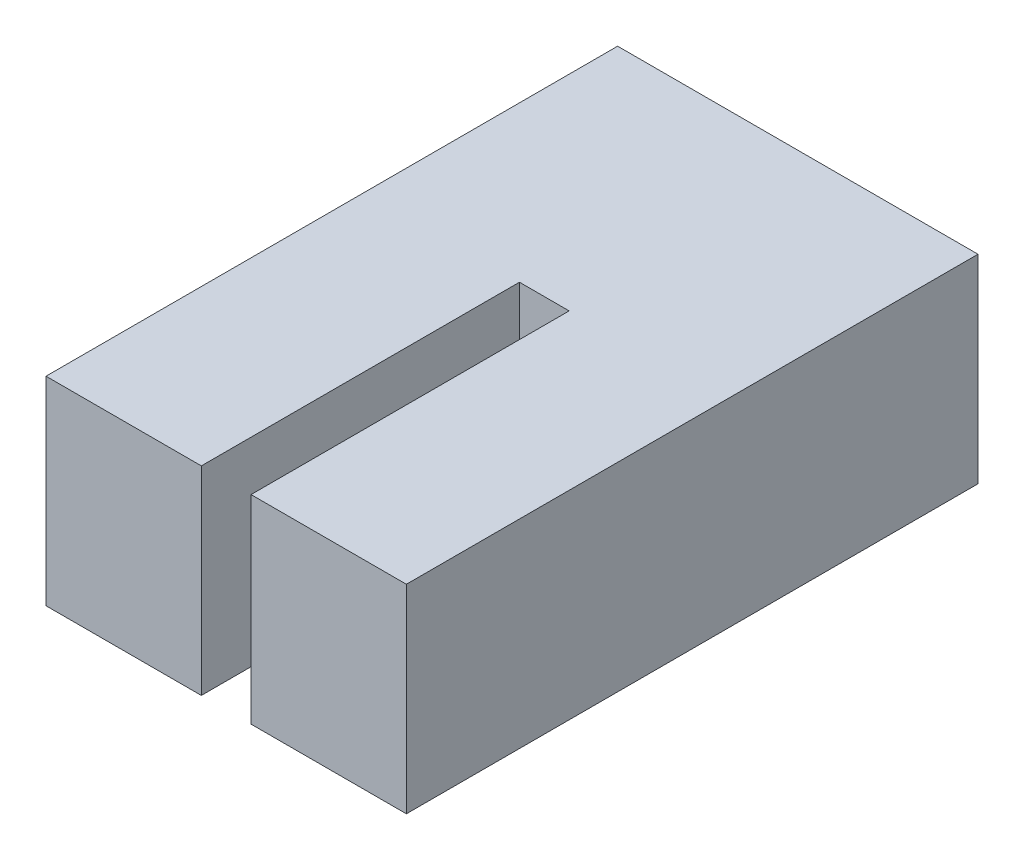
ISO-10303-21;
HEADER;
FILE_DESCRIPTION(('STEP AP214'),'2;1');
FILE_NAME('part.step','',(''),(''),'','','');
FILE_SCHEMA(('AUTOMOTIVE_DESIGN { 1 0 10303 214 1 1 1 1 }'));
ENDSEC;
DATA;
#1=APPLICATION_CONTEXT('core data for automotive mechanical design processes');
#2=APPLICATION_PROTOCOL_DEFINITION('international standard','automotive_design',2000,#1);
#3=PRODUCT_CONTEXT('',#1,'mechanical');
#4=PRODUCT('Part','Part','',(#3));
#5=PRODUCT_RELATED_PRODUCT_CATEGORY('part','',(#4));
#6=PRODUCT_DEFINITION_FORMATION('','',#4);
#7=PRODUCT_DEFINITION_CONTEXT('part definition',#1,'design');
#8=PRODUCT_DEFINITION('design','',#6,#7);
#9=PRODUCT_DEFINITION_SHAPE('','',#8);
#10=(LENGTH_UNIT() NAMED_UNIT(*) SI_UNIT(.MILLI.,.METRE.));
#11=(NAMED_UNIT(*) PLANE_ANGLE_UNIT() SI_UNIT($,.RADIAN.));
#12=(NAMED_UNIT(*) SI_UNIT($,.STERADIAN.) SOLID_ANGLE_UNIT());
#13=UNCERTAINTY_MEASURE_WITH_UNIT(LENGTH_MEASURE(1.E-05),#10,'distance_accuracy_value','');
#14=(GEOMETRIC_REPRESENTATION_CONTEXT(3) GLOBAL_UNCERTAINTY_ASSIGNED_CONTEXT((#13)) GLOBAL_UNIT_ASSIGNED_CONTEXT((#10,
#11,#12)) REPRESENTATION_CONTEXT('',''));
#15=CARTESIAN_POINT('',(0.,0.,0.));
#16=DIRECTION('',(0.,0.,1.));
#17=DIRECTION('',(1.,0.,0.));
#18=AXIS2_PLACEMENT_3D('',#15,#16,#17);
#19=CARTESIAN_POINT('',(0.,0.,23.));
#20=DIRECTION('',(0.,0.,-1.));
#21=DIRECTION('',(-1.,0.,0.));
#22=AXIS2_PLACEMENT_3D('',#19,#20,#21);
#23=PLANE('',#22);
#24=DIRECTION('',(1.,0.,0.));
#25=VECTOR('',#24,1.);
#26=CARTESIAN_POINT('',(14.5,0.,23.));
#27=LINE('',#26,#25);
#28=CARTESIAN_POINT('',(0.,0.,23.));
#29=VERTEX_POINT('',#28);
#30=CARTESIAN_POINT('',(6.25,0.,23.));
#31=VERTEX_POINT('',#30);
#32=EDGE_CURVE('E151',#29,#31,#27,.T.);
#33=ORIENTED_EDGE('',*,*,#32,.T.);
#34=DIRECTION('',(0.,1.,0.));
#35=VECTOR('',#34,1.);
#36=CARTESIAN_POINT('',(6.25,0.,23.));
#37=LINE('',#36,#35);
#38=CARTESIAN_POINT('',(6.25000000000001,8.,23.));
#39=VERTEX_POINT('',#38);
#40=EDGE_CURVE('E41',#31,#39,#37,.T.);
#41=ORIENTED_EDGE('',*,*,#40,.T.);
#42=DIRECTION('',(-1.,0.,0.));
#43=VECTOR('',#42,1.);
#44=CARTESIAN_POINT('',(0.,8.,23.));
#45=LINE('',#44,#43);
#46=CARTESIAN_POINT('',(0.,8.,23.));
#47=VERTEX_POINT('',#46);
#48=EDGE_CURVE('E126',#39,#47,#45,.T.);
#49=ORIENTED_EDGE('',*,*,#48,.T.);
#50=DIRECTION('',(0.,-1.,0.));
#51=VECTOR('',#50,1.);
#52=CARTESIAN_POINT('',(0.,0.,23.));
#53=LINE('',#52,#51);
#54=EDGE_CURVE('E57',#47,#29,#53,.T.);
#55=ORIENTED_EDGE('',*,*,#54,.T.);
#56=EDGE_LOOP('',(#33,#41,#49,#55));
#57=FACE_BOUND('',#56,.T.);
#58=ADVANCED_FACE('F33',(#57),#23,.F.);
#59=CARTESIAN_POINT('',(14.5,0.,23.));
#60=DIRECTION('',(0.,1.,0.));
#61=DIRECTION('',(-1.,0.,0.));
#62=AXIS2_PLACEMENT_3D('',#59,#60,#61);
#63=PLANE('',#62);
#64=DIRECTION('',(-1.,0.,0.));
#65=VECTOR('',#64,1.);
#66=CARTESIAN_POINT('',(14.5,0.,10.2));
#67=LINE('',#66,#65);
#68=CARTESIAN_POINT('',(8.25,0.,10.2));
#69=VERTEX_POINT('',#68);
#70=CARTESIAN_POINT('',(6.25,0.,10.2));
#71=VERTEX_POINT('',#70);
#72=EDGE_CURVE('E137',#69,#71,#67,.T.);
#73=ORIENTED_EDGE('',*,*,#72,.T.);
#74=DIRECTION('',(0.,0.,1.));
#75=VECTOR('',#74,1.);
#76=CARTESIAN_POINT('',(6.25,0.,23.));
#77=LINE('',#76,#75);
#78=EDGE_CURVE('E160',#71,#31,#77,.T.);
#79=ORIENTED_EDGE('',*,*,#78,.T.);
#80=ORIENTED_EDGE('',*,*,#32,.F.);
#81=DIRECTION('',(0.,0.,-1.));
#82=VECTOR('',#81,1.);
#83=CARTESIAN_POINT('',(0.,0.,23.));
#84=LINE('',#83,#82);
#85=CARTESIAN_POINT('',(0.,0.,0.));
#86=VERTEX_POINT('',#85);
#87=EDGE_CURVE('E128',#29,#86,#84,.T.);
#88=ORIENTED_EDGE('',*,*,#87,.T.);
#89=DIRECTION('',(1.,0.,0.));
#90=VECTOR('',#89,1.);
#91=CARTESIAN_POINT('',(14.5,0.,0.));
#92=LINE('',#91,#90);
#93=CARTESIAN_POINT('',(14.5,0.,0.));
#94=VERTEX_POINT('',#93);
#95=EDGE_CURVE('E133',#86,#94,#92,.T.);
#96=ORIENTED_EDGE('',*,*,#95,.T.);
#97=DIRECTION('',(0.,0.,-1.));
#98=VECTOR('',#97,1.);
#99=CARTESIAN_POINT('',(14.5,0.,23.));
#100=LINE('',#99,#98);
#101=CARTESIAN_POINT('',(14.5,0.,23.));
#102=VERTEX_POINT('',#101);
#103=EDGE_CURVE('E112',#102,#94,#100,.T.);
#104=ORIENTED_EDGE('',*,*,#103,.F.);
#105=CARTESIAN_POINT('',(8.25,0.,23.));
#106=VERTEX_POINT('',#105);
#107=EDGE_CURVE('E85',#106,#102,#27,.T.);
#108=ORIENTED_EDGE('',*,*,#107,.F.);
#109=DIRECTION('',(0.,0.,-1.));
#110=VECTOR('',#109,1.);
#111=CARTESIAN_POINT('',(8.25,0.,23.));
#112=LINE('',#111,#110);
#113=EDGE_CURVE('E48',#106,#69,#112,.T.);
#114=ORIENTED_EDGE('',*,*,#113,.T.);
#115=EDGE_LOOP('',(#73,#79,#80,#88,#96,#104,#108,#114));
#116=FACE_BOUND('',#115,.T.);
#117=ADVANCED_FACE('F35',(#116),#63,.F.);
#118=CARTESIAN_POINT('',(14.5,8.,23.));
#119=DIRECTION('',(-1.,0.,0.));
#120=DIRECTION('',(0.,0.,1.));
#121=AXIS2_PLACEMENT_3D('',#118,#119,#120);
#122=PLANE('',#121);
#123=DIRECTION('',(0.,1.,0.));
#124=VECTOR('',#123,1.);
#125=CARTESIAN_POINT('',(14.5,8.,0.));
#126=LINE('',#125,#124);
#127=CARTESIAN_POINT('',(14.5,8.,0.));
#128=VERTEX_POINT('',#127);
#129=EDGE_CURVE('E136',#94,#128,#126,.T.);
#130=ORIENTED_EDGE('',*,*,#129,.T.);
#131=DIRECTION('',(0.,0.,-1.));
#132=VECTOR('',#131,1.);
#133=CARTESIAN_POINT('',(14.5,8.,23.));
#134=LINE('',#133,#132);
#135=CARTESIAN_POINT('',(14.5,8.,23.));
#136=VERTEX_POINT('',#135);
#137=EDGE_CURVE('E145',#136,#128,#134,.T.);
#138=ORIENTED_EDGE('',*,*,#137,.F.);
#139=DIRECTION('',(0.,1.,0.));
#140=VECTOR('',#139,1.);
#141=CARTESIAN_POINT('',(14.5,8.,23.));
#142=LINE('',#141,#140);
#143=EDGE_CURVE('E124',#102,#136,#142,.T.);
#144=ORIENTED_EDGE('',*,*,#143,.F.);
#145=ORIENTED_EDGE('',*,*,#103,.T.);
#146=EDGE_LOOP('',(#130,#138,#144,#145));
#147=FACE_BOUND('',#146,.T.);
#148=ADVANCED_FACE('F172',(#147),#122,.F.);
#149=CARTESIAN_POINT('',(0.,8.,23.));
#150=DIRECTION('',(0.,-1.,0.));
#151=DIRECTION('',(0.,0.,-1.));
#152=AXIS2_PLACEMENT_3D('',#149,#150,#151);
#153=PLANE('',#152);
#154=ORIENTED_EDGE('',*,*,#48,.F.);
#155=DIRECTION('',(0.,0.,-1.));
#156=VECTOR('',#155,1.);
#157=CARTESIAN_POINT('',(6.25000000000001,8.,23.));
#158=LINE('',#157,#156);
#159=CARTESIAN_POINT('',(6.25000000000001,8.,10.2));
#160=VERTEX_POINT('',#159);
#161=EDGE_CURVE('E154',#39,#160,#158,.T.);
#162=ORIENTED_EDGE('',*,*,#161,.T.);
#163=DIRECTION('',(1.,0.,0.));
#164=VECTOR('',#163,1.);
#165=CARTESIAN_POINT('',(0.,8.,10.2));
#166=LINE('',#165,#164);
#167=CARTESIAN_POINT('',(8.25000000000001,8.,10.2));
#168=VERTEX_POINT('',#167);
#169=EDGE_CURVE('E11',#160,#168,#166,.T.);
#170=ORIENTED_EDGE('',*,*,#169,.T.);
#171=DIRECTION('',(0.,0.,1.));
#172=VECTOR('',#171,1.);
#173=CARTESIAN_POINT('',(8.25000000000001,8.,23.));
#174=LINE('',#173,#172);
#175=CARTESIAN_POINT('',(8.25000000000001,8.,23.));
#176=VERTEX_POINT('',#175);
#177=EDGE_CURVE('E109',#168,#176,#174,.T.);
#178=ORIENTED_EDGE('',*,*,#177,.T.);
#179=EDGE_CURVE('E119',#136,#176,#45,.T.);
#180=ORIENTED_EDGE('',*,*,#179,.F.);
#181=ORIENTED_EDGE('',*,*,#137,.T.);
#182=DIRECTION('',(-1.,0.,0.));
#183=VECTOR('',#182,1.);
#184=CARTESIAN_POINT('',(0.,8.,0.));
#185=LINE('',#184,#183);
#186=CARTESIAN_POINT('',(0.,8.,0.));
#187=VERTEX_POINT('',#186);
#188=EDGE_CURVE('E139',#128,#187,#185,.T.);
#189=ORIENTED_EDGE('',*,*,#188,.T.);
#190=DIRECTION('',(0.,0.,-1.));
#191=VECTOR('',#190,1.);
#192=CARTESIAN_POINT('',(0.,8.,23.));
#193=LINE('',#192,#191);
#194=EDGE_CURVE('E143',#47,#187,#193,.T.);
#195=ORIENTED_EDGE('',*,*,#194,.F.);
#196=EDGE_LOOP('',(#154,#162,#170,#178,#180,#181,#189,#195));
#197=FACE_BOUND('',#196,.T.);
#198=ADVANCED_FACE('F117',(#197),#153,.F.);
#199=CARTESIAN_POINT('',(0.,0.,23.));
#200=DIRECTION('',(1.,0.,0.));
#201=DIRECTION('',(0.,0.,-1.));
#202=AXIS2_PLACEMENT_3D('',#199,#200,#201);
#203=PLANE('',#202);
#204=DIRECTION('',(0.,-1.,0.));
#205=VECTOR('',#204,1.);
#206=CARTESIAN_POINT('',(0.,0.,0.));
#207=LINE('',#206,#205);
#208=EDGE_CURVE('E78',#187,#86,#207,.T.);
#209=ORIENTED_EDGE('',*,*,#208,.T.);
#210=ORIENTED_EDGE('',*,*,#87,.F.);
#211=ORIENTED_EDGE('',*,*,#54,.F.);
#212=ORIENTED_EDGE('',*,*,#194,.T.);
#213=EDGE_LOOP('',(#209,#210,#211,#212));
#214=FACE_BOUND('',#213,.T.);
#215=ADVANCED_FACE('F156',(#214),#203,.F.);
#216=ORIENTED_EDGE('',*,*,#179,.T.);
#217=DIRECTION('',(0.,-1.,0.));
#218=VECTOR('',#217,1.);
#219=CARTESIAN_POINT('',(8.25,0.,23.));
#220=LINE('',#219,#218);
#221=EDGE_CURVE('E106',#176,#106,#220,.T.);
#222=ORIENTED_EDGE('',*,*,#221,.T.);
#223=ORIENTED_EDGE('',*,*,#107,.T.);
#224=ORIENTED_EDGE('',*,*,#143,.T.);
#225=EDGE_LOOP('',(#216,#222,#223,#224));
#226=FACE_BOUND('',#225,.T.);
#227=ADVANCED_FACE('F123',(#226),#23,.F.);
#228=CARTESIAN_POINT('',(0.,0.,0.));
#229=DIRECTION('',(0.,0.,-1.));
#230=DIRECTION('',(-1.,0.,0.));
#231=AXIS2_PLACEMENT_3D('',#228,#229,#230);
#232=PLANE('',#231);
#233=ORIENTED_EDGE('',*,*,#95,.F.);
#234=ORIENTED_EDGE('',*,*,#208,.F.);
#235=ORIENTED_EDGE('',*,*,#188,.F.);
#236=ORIENTED_EDGE('',*,*,#129,.F.);
#237=EDGE_LOOP('',(#233,#234,#235,#236));
#238=FACE_BOUND('',#237,.T.);
#239=ADVANCED_FACE('F174',(#238),#232,.T.);
#240=CARTESIAN_POINT('',(6.25000000000003,35.427081801921,10.2));
#241=DIRECTION('',(0.,0.,-1.));
#242=DIRECTION('',(-1.,0.,0.));
#243=AXIS2_PLACEMENT_3D('',#240,#241,#242);
#244=PLANE('',#243);
#245=ORIENTED_EDGE('',*,*,#72,.F.);
#246=DIRECTION('',(0.,-1.,0.));
#247=VECTOR('',#246,1.);
#248=CARTESIAN_POINT('',(8.25000000000003,35.427081801921,10.2));
#249=LINE('',#248,#247);
#250=EDGE_CURVE('E168',#168,#69,#249,.T.);
#251=ORIENTED_EDGE('',*,*,#250,.F.);
#252=ORIENTED_EDGE('',*,*,#169,.F.);
#253=DIRECTION('',(0.,-1.,0.));
#254=VECTOR('',#253,1.);
#255=CARTESIAN_POINT('',(6.25000000000003,35.427081801921,10.2));
#256=LINE('',#255,#254);
#257=EDGE_CURVE('E121',#160,#71,#256,.T.);
#258=ORIENTED_EDGE('',*,*,#257,.T.);
#259=EDGE_LOOP('',(#245,#251,#252,#258));
#260=FACE_BOUND('',#259,.T.);
#261=ADVANCED_FACE('F176',(#260),#244,.F.);
#262=CARTESIAN_POINT('',(6.25000000000003,35.427081801921,23.));
#263=DIRECTION('',(-1.,0.,0.));
#264=DIRECTION('',(0.,-1.,0.));
#265=AXIS2_PLACEMENT_3D('',#262,#263,#264);
#266=PLANE('',#265);
#267=ORIENTED_EDGE('',*,*,#78,.F.);
#268=ORIENTED_EDGE('',*,*,#257,.F.);
#269=ORIENTED_EDGE('',*,*,#161,.F.);
#270=ORIENTED_EDGE('',*,*,#40,.F.);
#271=EDGE_LOOP('',(#267,#268,#269,#270));
#272=FACE_BOUND('',#271,.T.);
#273=ADVANCED_FACE('F182',(#272),#266,.F.);
#274=CARTESIAN_POINT('',(8.25000000000003,35.427081801921,10.2));
#275=DIRECTION('',(1.,0.,0.));
#276=DIRECTION('',(0.,1.,0.));
#277=AXIS2_PLACEMENT_3D('',#274,#275,#276);
#278=PLANE('',#277);
#279=ORIENTED_EDGE('',*,*,#113,.F.);
#280=ORIENTED_EDGE('',*,*,#221,.F.);
#281=ORIENTED_EDGE('',*,*,#177,.F.);
#282=ORIENTED_EDGE('',*,*,#250,.T.);
#283=EDGE_LOOP('',(#279,#280,#281,#282));
#284=FACE_BOUND('',#283,.T.);
#285=ADVANCED_FACE('F108',(#284),#278,.F.);
#286=CLOSED_SHELL('',(#58,#117,#148,#198,#215,#227,#239,#261,#273,#285));
#287=MANIFOLD_SOLID_BREP('B2',#286);
#288=ADVANCED_BREP_SHAPE_REPRESENTATION('',(#18,#287),#14);
#289=SHAPE_DEFINITION_REPRESENTATION(#9,#288);
ENDSEC;
END-ISO-10303-21;
